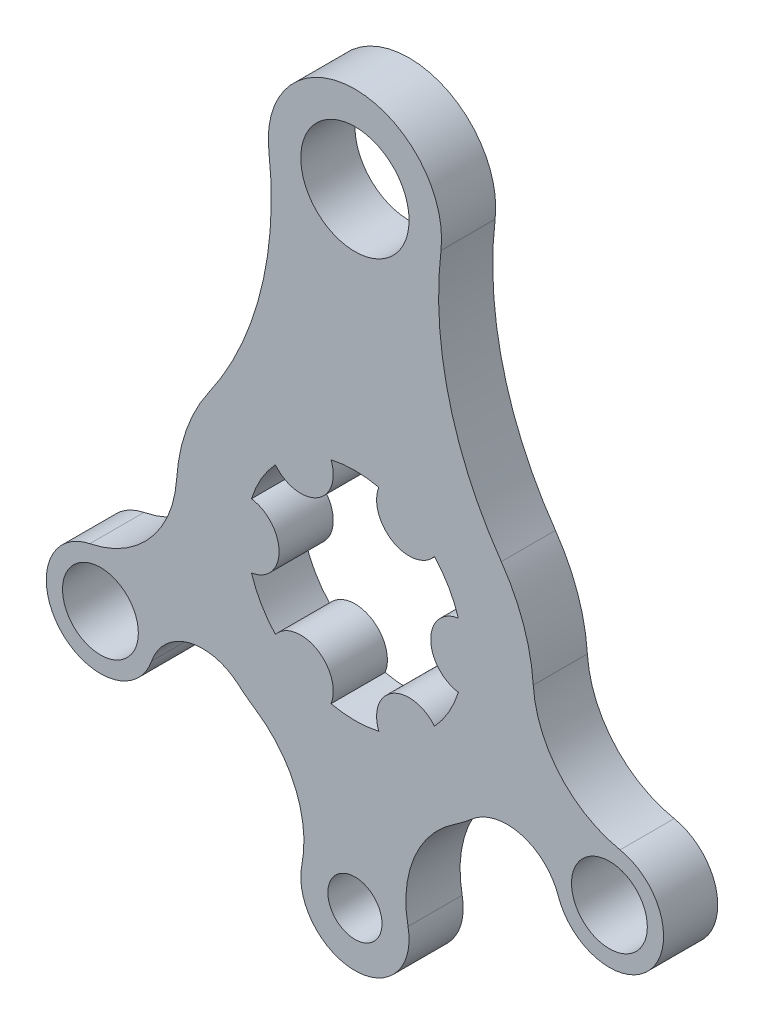
ISO-10303-21;
HEADER;
FILE_DESCRIPTION(('STEP AP214'),'2;1');
FILE_NAME('part.step','',(''),(''),'','','');
FILE_SCHEMA(('AUTOMOTIVE_DESIGN { 1 0 10303 214 1 1 1 1 }'));
ENDSEC;
DATA;
#1=APPLICATION_CONTEXT('core data for automotive mechanical design processes');
#2=APPLICATION_PROTOCOL_DEFINITION('international standard','automotive_design',2000,#1);
#3=PRODUCT_CONTEXT('',#1,'mechanical');
#4=PRODUCT('Part','Part','',(#3));
#5=PRODUCT_RELATED_PRODUCT_CATEGORY('part','',(#4));
#6=PRODUCT_DEFINITION_FORMATION('','',#4);
#7=PRODUCT_DEFINITION_CONTEXT('part definition',#1,'design');
#8=PRODUCT_DEFINITION('design','',#6,#7);
#9=PRODUCT_DEFINITION_SHAPE('','',#8);
#10=(LENGTH_UNIT() NAMED_UNIT(*) SI_UNIT(.MILLI.,.METRE.));
#11=(NAMED_UNIT(*) PLANE_ANGLE_UNIT() SI_UNIT($,.RADIAN.));
#12=(NAMED_UNIT(*) SI_UNIT($,.STERADIAN.) SOLID_ANGLE_UNIT());
#13=UNCERTAINTY_MEASURE_WITH_UNIT(LENGTH_MEASURE(1.E-05),#10,'distance_accuracy_value','');
#14=(GEOMETRIC_REPRESENTATION_CONTEXT(3) GLOBAL_UNCERTAINTY_ASSIGNED_CONTEXT((#13)) GLOBAL_UNIT_ASSIGNED_CONTEXT((#10,
#11,#12)) REPRESENTATION_CONTEXT('',''));
#15=CARTESIAN_POINT('',(0.,0.,0.));
#16=DIRECTION('',(0.,0.,1.));
#17=DIRECTION('',(1.,0.,0.));
#18=AXIS2_PLACEMENT_3D('',#15,#16,#17);
#19=CARTESIAN_POINT('',(0.,0.,5.));
#20=DIRECTION('',(0.,0.,-1.));
#21=DIRECTION('',(-1.,0.,0.));
#22=AXIS2_PLACEMENT_3D('',#19,#20,#21);
#23=CYLINDRICAL_SURFACE('',#22,20.);
#24=CARTESIAN_POINT('',(0.,0.,-5.));
#25=DIRECTION('',(0.,0.,1.));
#26=DIRECTION('',(1.,0.,0.));
#27=AXIS2_PLACEMENT_3D('',#24,#25,#26);
#28=CIRCLE('',#27,20.);
#29=CARTESIAN_POINT('',(19.1,5.93211597998556,-5.));
#30=VERTEX_POINT('',#29);
#31=CARTESIAN_POINT('',(14.6873631368633,13.5750272222898,-5.));
#32=VERTEX_POINT('',#31);
#33=EDGE_CURVE('E312',#30,#32,#28,.T.);
#34=ORIENTED_EDGE('',*,*,#33,.F.);
#35=DIRECTION('',(0.,0.,-1.));
#36=VECTOR('',#35,1.);
#37=CARTESIAN_POINT('',(19.1,5.93211597998556,5.));
#38=LINE('',#37,#36);
#39=CARTESIAN_POINT('',(19.1,5.93211597998556,5.));
#40=VERTEX_POINT('',#39);
#41=EDGE_CURVE('E11',#40,#30,#38,.T.);
#42=ORIENTED_EDGE('',*,*,#41,.F.);
#43=CARTESIAN_POINT('',(0.,0.,5.));
#44=DIRECTION('',(0.,0.,1.));
#45=DIRECTION('',(1.,0.,0.));
#46=AXIS2_PLACEMENT_3D('',#43,#44,#45);
#47=CIRCLE('',#46,20.);
#48=CARTESIAN_POINT('',(14.6873631368633,13.5750272222898,5.));
#49=VERTEX_POINT('',#48);
#50=EDGE_CURVE('E517',#40,#49,#47,.T.);
#51=ORIENTED_EDGE('',*,*,#50,.T.);
#52=DIRECTION('',(0.,0.,-1.));
#53=VECTOR('',#52,1.);
#54=CARTESIAN_POINT('',(14.6873631368633,13.5750272222898,5.));
#55=LINE('',#54,#53);
#56=EDGE_CURVE('E150',#49,#32,#55,.T.);
#57=ORIENTED_EDGE('',*,*,#56,.T.);
#58=EDGE_LOOP('',(#34,#42,#51,#57));
#59=FACE_BOUND('',#58,.T.);
#60=ADVANCED_FACE('F37',(#59),#23,.F.);
#61=CARTESIAN_POINT('',(20.,0.,5.));
#62=DIRECTION('',(0.,0.,-1.));
#63=DIRECTION('',(-1.,0.,0.));
#64=AXIS2_PLACEMENT_3D('',#61,#62,#63);
#65=CYLINDRICAL_SURFACE('',#64,6.);
#66=CARTESIAN_POINT('',(20.,0.,-5.));
#67=DIRECTION('',(0.,0.,1.));
#68=DIRECTION('',(1.,0.,0.));
#69=AXIS2_PLACEMENT_3D('',#66,#67,#68);
#70=CIRCLE('',#69,6.);
#71=CARTESIAN_POINT('',(19.1,-5.93211597998556,-5.));
#72=VERTEX_POINT('',#71);
#73=EDGE_CURVE('E315',#30,#72,#70,.T.);
#74=ORIENTED_EDGE('',*,*,#73,.T.);
#75=DIRECTION('',(0.,0.,-1.));
#76=VECTOR('',#75,1.);
#77=CARTESIAN_POINT('',(19.1,-5.93211597998556,5.));
#78=LINE('',#77,#76);
#79=CARTESIAN_POINT('',(19.1,-5.93211597998556,5.));
#80=VERTEX_POINT('',#79);
#81=EDGE_CURVE('E47',#80,#72,#78,.T.);
#82=ORIENTED_EDGE('',*,*,#81,.F.);
#83=CARTESIAN_POINT('',(20.,0.,5.));
#84=DIRECTION('',(0.,0.,1.));
#85=DIRECTION('',(1.,0.,0.));
#86=AXIS2_PLACEMENT_3D('',#83,#84,#85);
#87=CIRCLE('',#86,6.);
#88=EDGE_CURVE('E519',#40,#80,#87,.T.);
#89=ORIENTED_EDGE('',*,*,#88,.F.);
#90=ORIENTED_EDGE('',*,*,#41,.T.);
#91=EDGE_LOOP('',(#74,#82,#89,#90));
#92=FACE_BOUND('',#91,.T.);
#93=ADVANCED_FACE('F548',(#92),#65,.T.);
#94=CARTESIAN_POINT('',(0.,0.,5.));
#95=DIRECTION('',(0.,0.,-1.));
#96=DIRECTION('',(-1.,0.,0.));
#97=AXIS2_PLACEMENT_3D('',#94,#95,#96);
#98=CYLINDRICAL_SURFACE('',#97,20.);
#99=CARTESIAN_POINT('',(0.,0.,-5.));
#100=DIRECTION('',(0.,0.,1.));
#101=DIRECTION('',(1.,0.,0.));
#102=AXIS2_PLACEMENT_3D('',#99,#100,#101);
#103=CIRCLE('',#102,20.);
#104=CARTESIAN_POINT('',(14.6873631368631,-13.57502722229,-5.));
#105=VERTEX_POINT('',#104);
#106=EDGE_CURVE('E318',#105,#72,#103,.T.);
#107=ORIENTED_EDGE('',*,*,#106,.F.);
#108=DIRECTION('',(0.,0.,-1.));
#109=VECTOR('',#108,1.);
#110=CARTESIAN_POINT('',(14.6873631368631,-13.57502722229,5.));
#111=LINE('',#110,#109);
#112=CARTESIAN_POINT('',(14.6873631368631,-13.57502722229,5.));
#113=VERTEX_POINT('',#112);
#114=EDGE_CURVE('E367',#113,#105,#111,.T.);
#115=ORIENTED_EDGE('',*,*,#114,.F.);
#116=CARTESIAN_POINT('',(0.,0.,5.));
#117=DIRECTION('',(0.,0.,1.));
#118=DIRECTION('',(1.,0.,0.));
#119=AXIS2_PLACEMENT_3D('',#116,#117,#118);
#120=CIRCLE('',#119,20.);
#121=EDGE_CURVE('E521',#113,#80,#120,.T.);
#122=ORIENTED_EDGE('',*,*,#121,.T.);
#123=ORIENTED_EDGE('',*,*,#81,.T.);
#124=EDGE_LOOP('',(#107,#115,#122,#123));
#125=FACE_BOUND('',#124,.T.);
#126=ADVANCED_FACE('F551',(#125),#98,.F.);
#127=CARTESIAN_POINT('',(10.,-17.3205080756888,5.));
#128=DIRECTION('',(0.,0.,-1.));
#129=DIRECTION('',(-1.,0.,0.));
#130=AXIS2_PLACEMENT_3D('',#127,#128,#129);
#131=CYLINDRICAL_SURFACE('',#130,6.);
#132=CARTESIAN_POINT('',(10.,-17.3205080756888,-5.));
#133=DIRECTION('',(0.,0.,1.));
#134=DIRECTION('',(1.,0.,0.));
#135=AXIS2_PLACEMENT_3D('',#132,#133,#134);
#136=CIRCLE('',#135,6.);
#137=CARTESIAN_POINT('',(4.41263686313688,-19.5071432022755,-5.));
#138=VERTEX_POINT('',#137);
#139=EDGE_CURVE('E321',#105,#138,#136,.T.);
#140=ORIENTED_EDGE('',*,*,#139,.T.);
#141=DIRECTION('',(0.,0.,-1.));
#142=VECTOR('',#141,1.);
#143=CARTESIAN_POINT('',(4.41263686313688,-19.5071432022755,5.));
#144=LINE('',#143,#142);
#145=CARTESIAN_POINT('',(4.41263686313688,-19.5071432022755,5.));
#146=VERTEX_POINT('',#145);
#147=EDGE_CURVE('E365',#146,#138,#144,.T.);
#148=ORIENTED_EDGE('',*,*,#147,.F.);
#149=CARTESIAN_POINT('',(10.,-17.3205080756888,5.));
#150=DIRECTION('',(0.,0.,1.));
#151=DIRECTION('',(1.,0.,0.));
#152=AXIS2_PLACEMENT_3D('',#149,#150,#151);
#153=CIRCLE('',#152,6.);
#154=EDGE_CURVE('E524',#113,#146,#153,.T.);
#155=ORIENTED_EDGE('',*,*,#154,.F.);
#156=ORIENTED_EDGE('',*,*,#114,.T.);
#157=EDGE_LOOP('',(#140,#148,#155,#156));
#158=FACE_BOUND('',#157,.T.);
#159=ADVANCED_FACE('F556',(#158),#131,.T.);
#160=CARTESIAN_POINT('',(0.,0.,5.));
#161=DIRECTION('',(0.,0.,-1.));
#162=DIRECTION('',(-1.,0.,0.));
#163=AXIS2_PLACEMENT_3D('',#160,#161,#162);
#164=CYLINDRICAL_SURFACE('',#163,20.);
#165=CARTESIAN_POINT('',(0.,0.,-5.));
#166=DIRECTION('',(0.,0.,1.));
#167=DIRECTION('',(1.,0.,0.));
#168=AXIS2_PLACEMENT_3D('',#165,#166,#167);
#169=CIRCLE('',#168,20.);
#170=CARTESIAN_POINT('',(-4.41263686313698,-19.5071432022755,-5.));
#171=VERTEX_POINT('',#170);
#172=EDGE_CURVE('E324',#171,#138,#169,.T.);
#173=ORIENTED_EDGE('',*,*,#172,.F.);
#174=DIRECTION('',(0.,0.,-1.));
#175=VECTOR('',#174,1.);
#176=CARTESIAN_POINT('',(-4.41263686313698,-19.5071432022755,5.));
#177=LINE('',#176,#175);
#178=CARTESIAN_POINT('',(-4.41263686313698,-19.5071432022755,5.));
#179=VERTEX_POINT('',#178);
#180=EDGE_CURVE('E363',#179,#171,#177,.T.);
#181=ORIENTED_EDGE('',*,*,#180,.F.);
#182=CARTESIAN_POINT('',(0.,0.,5.));
#183=DIRECTION('',(0.,0.,1.));
#184=DIRECTION('',(1.,0.,0.));
#185=AXIS2_PLACEMENT_3D('',#182,#183,#184);
#186=CIRCLE('',#185,20.);
#187=EDGE_CURVE('E526',#179,#146,#186,.T.);
#188=ORIENTED_EDGE('',*,*,#187,.T.);
#189=ORIENTED_EDGE('',*,*,#147,.T.);
#190=EDGE_LOOP('',(#173,#181,#188,#189));
#191=FACE_BOUND('',#190,.T.);
#192=ADVANCED_FACE('F563',(#191),#164,.F.);
#193=CARTESIAN_POINT('',(-10.0000000000001,-17.3205080756887,5.));
#194=DIRECTION('',(0.,0.,-1.));
#195=DIRECTION('',(-1.,0.,0.));
#196=AXIS2_PLACEMENT_3D('',#193,#194,#195);
#197=CYLINDRICAL_SURFACE('',#196,5.99999999999999);
#198=CARTESIAN_POINT('',(-10.0000000000001,-17.3205080756887,-5.));
#199=DIRECTION('',(0.,0.,1.));
#200=DIRECTION('',(1.,0.,0.));
#201=AXIS2_PLACEMENT_3D('',#198,#199,#200);
#202=CIRCLE('',#201,5.99999999999999);
#203=CARTESIAN_POINT('',(-14.6873631368632,-13.5750272222899,-5.));
#204=VERTEX_POINT('',#203);
#205=EDGE_CURVE('E327',#171,#204,#202,.T.);
#206=ORIENTED_EDGE('',*,*,#205,.T.);
#207=DIRECTION('',(0.,0.,-1.));
#208=VECTOR('',#207,1.);
#209=CARTESIAN_POINT('',(-14.6873631368632,-13.5750272222899,5.));
#210=LINE('',#209,#208);
#211=CARTESIAN_POINT('',(-14.6873631368632,-13.5750272222899,5.));
#212=VERTEX_POINT('',#211);
#213=EDGE_CURVE('E361',#212,#204,#210,.T.);
#214=ORIENTED_EDGE('',*,*,#213,.F.);
#215=CARTESIAN_POINT('',(-10.0000000000001,-17.3205080756887,5.));
#216=DIRECTION('',(0.,0.,1.));
#217=DIRECTION('',(1.,0.,0.));
#218=AXIS2_PLACEMENT_3D('',#215,#216,#217);
#219=CIRCLE('',#218,5.99999999999999);
#220=EDGE_CURVE('E529',#179,#212,#219,.T.);
#221=ORIENTED_EDGE('',*,*,#220,.F.);
#222=ORIENTED_EDGE('',*,*,#180,.T.);
#223=EDGE_LOOP('',(#206,#214,#221,#222));
#224=FACE_BOUND('',#223,.T.);
#225=ADVANCED_FACE('F566',(#224),#197,.T.);
#226=CARTESIAN_POINT('',(0.,0.,5.));
#227=DIRECTION('',(0.,0.,-1.));
#228=DIRECTION('',(-1.,0.,0.));
#229=AXIS2_PLACEMENT_3D('',#226,#227,#228);
#230=CYLINDRICAL_SURFACE('',#229,20.);
#231=CARTESIAN_POINT('',(0.,0.,-5.));
#232=DIRECTION('',(0.,0.,1.));
#233=DIRECTION('',(1.,0.,0.));
#234=AXIS2_PLACEMENT_3D('',#231,#232,#233);
#235=CIRCLE('',#234,20.);
#236=CARTESIAN_POINT('',(-19.1,-5.93211597998557,-5.));
#237=VERTEX_POINT('',#236);
#238=EDGE_CURVE('E330',#237,#204,#235,.T.);
#239=ORIENTED_EDGE('',*,*,#238,.F.);
#240=DIRECTION('',(0.,0.,-1.));
#241=VECTOR('',#240,1.);
#242=CARTESIAN_POINT('',(-19.1,-5.93211597998557,5.));
#243=LINE('',#242,#241);
#244=CARTESIAN_POINT('',(-19.1,-5.93211597998557,5.));
#245=VERTEX_POINT('',#244);
#246=EDGE_CURVE('E359',#245,#237,#243,.T.);
#247=ORIENTED_EDGE('',*,*,#246,.F.);
#248=CARTESIAN_POINT('',(0.,0.,5.));
#249=DIRECTION('',(0.,0.,1.));
#250=DIRECTION('',(1.,0.,0.));
#251=AXIS2_PLACEMENT_3D('',#248,#249,#250);
#252=CIRCLE('',#251,20.);
#253=EDGE_CURVE('E531',#245,#212,#252,.T.);
#254=ORIENTED_EDGE('',*,*,#253,.T.);
#255=ORIENTED_EDGE('',*,*,#213,.T.);
#256=EDGE_LOOP('',(#239,#247,#254,#255));
#257=FACE_BOUND('',#256,.T.);
#258=ADVANCED_FACE('F569',(#257),#230,.F.);
#259=CARTESIAN_POINT('',(-20.,0.,5.));
#260=DIRECTION('',(0.,0.,-1.));
#261=DIRECTION('',(-1.,0.,0.));
#262=AXIS2_PLACEMENT_3D('',#259,#260,#261);
#263=CYLINDRICAL_SURFACE('',#262,6.);
#264=CARTESIAN_POINT('',(-20.,0.,-5.));
#265=DIRECTION('',(0.,0.,1.));
#266=DIRECTION('',(1.,0.,0.));
#267=AXIS2_PLACEMENT_3D('',#264,#265,#266);
#268=CIRCLE('',#267,6.);
#269=CARTESIAN_POINT('',(-19.1,5.93211597998555,-5.));
#270=VERTEX_POINT('',#269);
#271=EDGE_CURVE('E333',#237,#270,#268,.T.);
#272=ORIENTED_EDGE('',*,*,#271,.T.);
#273=DIRECTION('',(0.,0.,-1.));
#274=VECTOR('',#273,1.);
#275=CARTESIAN_POINT('',(-19.1,5.93211597998555,5.));
#276=LINE('',#275,#274);
#277=CARTESIAN_POINT('',(-19.1,5.93211597998555,5.));
#278=VERTEX_POINT('',#277);
#279=EDGE_CURVE('E357',#278,#270,#276,.T.);
#280=ORIENTED_EDGE('',*,*,#279,.F.);
#281=CARTESIAN_POINT('',(-20.,0.,5.));
#282=DIRECTION('',(0.,0.,1.));
#283=DIRECTION('',(1.,0.,0.));
#284=AXIS2_PLACEMENT_3D('',#281,#282,#283);
#285=CIRCLE('',#284,6.);
#286=EDGE_CURVE('E534',#245,#278,#285,.T.);
#287=ORIENTED_EDGE('',*,*,#286,.F.);
#288=ORIENTED_EDGE('',*,*,#246,.T.);
#289=EDGE_LOOP('',(#272,#280,#287,#288));
#290=FACE_BOUND('',#289,.T.);
#291=ADVANCED_FACE('F572',(#290),#263,.T.);
#292=CARTESIAN_POINT('',(0.,0.,5.));
#293=DIRECTION('',(0.,0.,-1.));
#294=DIRECTION('',(-1.,0.,0.));
#295=AXIS2_PLACEMENT_3D('',#292,#293,#294);
#296=CYLINDRICAL_SURFACE('',#295,20.);
#297=CARTESIAN_POINT('',(0.,0.,-5.));
#298=DIRECTION('',(0.,0.,1.));
#299=DIRECTION('',(1.,0.,0.));
#300=AXIS2_PLACEMENT_3D('',#297,#298,#299);
#301=CIRCLE('',#300,20.);
#302=CARTESIAN_POINT('',(-14.6873631368631,13.57502722229,-5.));
#303=VERTEX_POINT('',#302);
#304=EDGE_CURVE('E336',#303,#270,#301,.T.);
#305=ORIENTED_EDGE('',*,*,#304,.F.);
#306=DIRECTION('',(0.,0.,-1.));
#307=VECTOR('',#306,1.);
#308=CARTESIAN_POINT('',(-14.6873631368631,13.57502722229,5.));
#309=LINE('',#308,#307);
#310=CARTESIAN_POINT('',(-14.6873631368631,13.57502722229,5.));
#311=VERTEX_POINT('',#310);
#312=EDGE_CURVE('E250',#311,#303,#309,.T.);
#313=ORIENTED_EDGE('',*,*,#312,.F.);
#314=CARTESIAN_POINT('',(0.,0.,5.));
#315=DIRECTION('',(0.,0.,1.));
#316=DIRECTION('',(1.,0.,0.));
#317=AXIS2_PLACEMENT_3D('',#314,#315,#316);
#318=CIRCLE('',#317,20.);
#319=EDGE_CURVE('E239',#311,#278,#318,.T.);
#320=ORIENTED_EDGE('',*,*,#319,.T.);
#321=ORIENTED_EDGE('',*,*,#279,.T.);
#322=EDGE_LOOP('',(#305,#313,#320,#321));
#323=FACE_BOUND('',#322,.T.);
#324=ADVANCED_FACE('F537',(#323),#296,.F.);
#325=CARTESIAN_POINT('',(-10.,17.3205080756888,5.));
#326=DIRECTION('',(0.,0.,-1.));
#327=DIRECTION('',(-1.,0.,0.));
#328=AXIS2_PLACEMENT_3D('',#325,#326,#327);
#329=CYLINDRICAL_SURFACE('',#328,6.00000000000001);
#330=CARTESIAN_POINT('',(-10.,17.3205080756888,-5.));
#331=DIRECTION('',(0.,0.,1.));
#332=DIRECTION('',(1.,0.,0.));
#333=AXIS2_PLACEMENT_3D('',#330,#331,#332);
#334=CIRCLE('',#333,6.00000000000001);
#335=CARTESIAN_POINT('',(-4.41263686313689,19.5071432022756,-5.));
#336=VERTEX_POINT('',#335);
#337=EDGE_CURVE('E246',#303,#336,#334,.T.);
#338=ORIENTED_EDGE('',*,*,#337,.T.);
#339=DIRECTION('',(0.,0.,-1.));
#340=VECTOR('',#339,1.);
#341=CARTESIAN_POINT('',(-4.41263686313689,19.5071432022756,5.));
#342=LINE('',#341,#340);
#343=CARTESIAN_POINT('',(-4.41263686313689,19.5071432022756,5.));
#344=VERTEX_POINT('',#343);
#345=EDGE_CURVE('E243',#344,#336,#342,.T.);
#346=ORIENTED_EDGE('',*,*,#345,.F.);
#347=CARTESIAN_POINT('',(-10.,17.3205080756888,5.));
#348=DIRECTION('',(0.,0.,1.));
#349=DIRECTION('',(1.,0.,0.));
#350=AXIS2_PLACEMENT_3D('',#347,#348,#349);
#351=CIRCLE('',#350,6.00000000000001);
#352=EDGE_CURVE('E232',#311,#344,#351,.T.);
#353=ORIENTED_EDGE('',*,*,#352,.F.);
#354=ORIENTED_EDGE('',*,*,#312,.T.);
#355=EDGE_LOOP('',(#338,#346,#353,#354));
#356=FACE_BOUND('',#355,.T.);
#357=ADVANCED_FACE('F244',(#356),#329,.T.);
#358=CARTESIAN_POINT('',(0.,0.,5.));
#359=DIRECTION('',(0.,0.,-1.));
#360=DIRECTION('',(-1.,0.,0.));
#361=AXIS2_PLACEMENT_3D('',#358,#359,#360);
#362=CYLINDRICAL_SURFACE('',#361,20.);
#363=CARTESIAN_POINT('',(0.,0.,-5.));
#364=DIRECTION('',(0.,0.,1.));
#365=DIRECTION('',(1.,0.,0.));
#366=AXIS2_PLACEMENT_3D('',#363,#364,#365);
#367=CIRCLE('',#366,20.);
#368=CARTESIAN_POINT('',(4.4126368631371,19.5071432022755,-5.));
#369=VERTEX_POINT('',#368);
#370=EDGE_CURVE('E340',#369,#336,#367,.T.);
#371=ORIENTED_EDGE('',*,*,#370,.F.);
#372=DIRECTION('',(0.,0.,-1.));
#373=VECTOR('',#372,1.);
#374=CARTESIAN_POINT('',(4.4126368631371,19.5071432022755,5.));
#375=LINE('',#374,#373);
#376=CARTESIAN_POINT('',(4.4126368631371,19.5071432022755,5.));
#377=VERTEX_POINT('',#376);
#378=EDGE_CURVE('E143',#377,#369,#375,.T.);
#379=ORIENTED_EDGE('',*,*,#378,.F.);
#380=CARTESIAN_POINT('',(0.,0.,5.));
#381=DIRECTION('',(0.,0.,1.));
#382=DIRECTION('',(1.,0.,0.));
#383=AXIS2_PLACEMENT_3D('',#380,#381,#382);
#384=CIRCLE('',#383,20.);
#385=EDGE_CURVE('E237',#377,#344,#384,.T.);
#386=ORIENTED_EDGE('',*,*,#385,.T.);
#387=ORIENTED_EDGE('',*,*,#345,.T.);
#388=EDGE_LOOP('',(#371,#379,#386,#387));
#389=FACE_BOUND('',#388,.T.);
#390=ADVANCED_FACE('F252',(#389),#362,.F.);
#391=CARTESIAN_POINT('',(52.8897897671533,3.41615842523861,5.));
#392=DIRECTION('',(0.,0.,-1.));
#393=DIRECTION('',(-1.,0.,0.));
#394=AXIS2_PLACEMENT_3D('',#391,#392,#393);
#395=CYLINDRICAL_SURFACE('',#394,20.);
#396=CARTESIAN_POINT('',(52.8897897671533,3.41615842523861,-5.));
#397=DIRECTION('',(0.,0.,1.));
#398=DIRECTION('',(1.,0.,0.));
#399=AXIS2_PLACEMENT_3D('',#396,#397,#398);
#400=CIRCLE('',#399,20.);
#401=CARTESIAN_POINT('',(32.9313785342653,2.12704203835612,-5.));
#402=VERTEX_POINT('',#401);
#403=CARTESIAN_POINT('',(48.9632632557178,-16.1946138582538,-5.));
#404=VERTEX_POINT('',#403);
#405=EDGE_CURVE('E267',#402,#404,#400,.T.);
#406=ORIENTED_EDGE('',*,*,#405,.F.);
#407=DIRECTION('',(0.,0.,-1.));
#408=VECTOR('',#407,1.);
#409=CARTESIAN_POINT('',(32.9313785342653,2.12704203835612,5.));
#410=LINE('',#409,#408);
#411=CARTESIAN_POINT('',(32.9313785342653,2.12704203835612,5.));
#412=VERTEX_POINT('',#411);
#413=EDGE_CURVE('E41',#412,#402,#410,.T.);
#414=ORIENTED_EDGE('',*,*,#413,.F.);
#415=CARTESIAN_POINT('',(52.8897897671533,3.41615842523861,5.));
#416=DIRECTION('',(0.,0.,1.));
#417=DIRECTION('',(1.,0.,0.));
#418=AXIS2_PLACEMENT_3D('',#415,#416,#417);
#419=CIRCLE('',#418,20.);
#420=CARTESIAN_POINT('',(48.9632632557178,-16.1946138582538,5.));
#421=VERTEX_POINT('',#420);
#422=EDGE_CURVE('E353',#412,#421,#419,.T.);
#423=ORIENTED_EDGE('',*,*,#422,.T.);
#424=DIRECTION('',(0.,0.,-1.));
#425=VECTOR('',#424,1.);
#426=CARTESIAN_POINT('',(48.9632632557178,-16.1946138582538,5.));
#427=LINE('',#426,#425);
#428=EDGE_CURVE('E266',#421,#404,#427,.T.);
#429=ORIENTED_EDGE('',*,*,#428,.T.);
#430=EDGE_LOOP('',(#406,#414,#423,#429));
#431=FACE_BOUND('',#430,.T.);
#432=ADVANCED_FACE('F39',(#431),#395,.F.);
#433=CARTESIAN_POINT('',(0.,0.,5.));
#434=DIRECTION('',(0.,0.,-1.));
#435=DIRECTION('',(-1.,0.,0.));
#436=AXIS2_PLACEMENT_3D('',#433,#434,#435);
#437=CYLINDRICAL_SURFACE('',#436,33.);
#438=CARTESIAN_POINT('',(0.,0.,-5.));
#439=DIRECTION('',(0.,0.,1.));
#440=DIRECTION('',(1.,0.,0.));
#441=AXIS2_PLACEMENT_3D('',#438,#439,#440);
#442=CIRCLE('',#441,33.);
#443=CARTESIAN_POINT('',(27.0298161974661,18.931165741475,-5.));
#444=VERTEX_POINT('',#443);
#445=EDGE_CURVE('E270',#402,#444,#442,.T.);
#446=ORIENTED_EDGE('',*,*,#445,.T.);
#447=DIRECTION('',(0.,0.,-1.));
#448=VECTOR('',#447,1.);
#449=CARTESIAN_POINT('',(27.0298161974661,18.931165741475,5.));
#450=LINE('',#449,#448);
#451=CARTESIAN_POINT('',(27.0298161974661,18.931165741475,5.));
#452=VERTEX_POINT('',#451);
#453=EDGE_CURVE('E402',#452,#444,#450,.T.);
#454=ORIENTED_EDGE('',*,*,#453,.F.);
#455=CARTESIAN_POINT('',(0.,0.,5.));
#456=DIRECTION('',(0.,0.,1.));
#457=DIRECTION('',(1.,0.,0.));
#458=AXIS2_PLACEMENT_3D('',#455,#456,#457);
#459=CIRCLE('',#458,33.);
#460=EDGE_CURVE('E410',#412,#452,#459,.T.);
#461=ORIENTED_EDGE('',*,*,#460,.F.);
#462=ORIENTED_EDGE('',*,*,#413,.T.);
#463=EDGE_LOOP('',(#446,#454,#461,#462));
#464=FACE_BOUND('',#463,.T.);
#465=ADVANCED_FACE('F409',(#464),#437,.T.);
#466=CARTESIAN_POINT('',(79.4512779137641,55.6461538461538,5.));
#467=DIRECTION('',(0.,0.,-1.));
#468=DIRECTION('',(-1.,0.,0.));
#469=AXIS2_PLACEMENT_3D('',#466,#467,#468);
#470=CYLINDRICAL_SURFACE('',#469,64.);
#471=CARTESIAN_POINT('',(79.4512779137641,55.6461538461538,-5.));
#472=DIRECTION('',(0.,0.,1.));
#473=DIRECTION('',(1.,0.,0.));
#474=AXIS2_PLACEMENT_3D('',#471,#472,#473);
#475=CIRCLE('',#474,64.);
#476=CARTESIAN_POINT('',(15.8902555827528,63.1292307692308,-5.));
#477=VERTEX_POINT('',#476);
#478=EDGE_CURVE('E273',#477,#444,#475,.T.);
#479=ORIENTED_EDGE('',*,*,#478,.F.);
#480=DIRECTION('',(0.,0.,-1.));
#481=VECTOR('',#480,1.);
#482=CARTESIAN_POINT('',(15.8902555827528,63.1292307692308,5.));
#483=LINE('',#482,#481);
#484=CARTESIAN_POINT('',(15.8902555827528,63.1292307692308,5.));
#485=VERTEX_POINT('',#484);
#486=EDGE_CURVE('E401',#485,#477,#483,.T.);
#487=ORIENTED_EDGE('',*,*,#486,.F.);
#488=CARTESIAN_POINT('',(79.4512779137641,55.6461538461538,5.));
#489=DIRECTION('',(0.,0.,1.));
#490=DIRECTION('',(1.,0.,0.));
#491=AXIS2_PLACEMENT_3D('',#488,#489,#490);
#492=CIRCLE('',#491,64.);
#493=EDGE_CURVE('E491',#485,#452,#492,.T.);
#494=ORIENTED_EDGE('',*,*,#493,.T.);
#495=ORIENTED_EDGE('',*,*,#453,.T.);
#496=EDGE_LOOP('',(#479,#487,#494,#495));
#497=FACE_BOUND('',#496,.T.);
#498=ADVANCED_FACE('F490',(#497),#470,.F.);
#499=CARTESIAN_POINT('',(0.,65.,5.));
#500=DIRECTION('',(0.,0.,-1.));
#501=DIRECTION('',(-1.,0.,0.));
#502=AXIS2_PLACEMENT_3D('',#499,#500,#501);
#503=CYLINDRICAL_SURFACE('',#502,16.);
#504=CARTESIAN_POINT('',(0.,65.,-5.));
#505=DIRECTION('',(0.,0.,1.));
#506=DIRECTION('',(1.,0.,0.));
#507=AXIS2_PLACEMENT_3D('',#504,#505,#506);
#508=CIRCLE('',#507,16.);
#509=CARTESIAN_POINT('',(-15.8902555827528,63.1292307692308,-5.));
#510=VERTEX_POINT('',#509);
#511=EDGE_CURVE('E276',#477,#510,#508,.T.);
#512=ORIENTED_EDGE('',*,*,#511,.T.);
#513=DIRECTION('',(0.,0.,-1.));
#514=VECTOR('',#513,1.);
#515=CARTESIAN_POINT('',(-15.8902555827528,63.1292307692308,5.));
#516=LINE('',#515,#514);
#517=CARTESIAN_POINT('',(-15.8902555827528,63.1292307692308,5.));
#518=VERTEX_POINT('',#517);
#519=EDGE_CURVE('E398',#518,#510,#516,.T.);
#520=ORIENTED_EDGE('',*,*,#519,.F.);
#521=CARTESIAN_POINT('',(0.,65.,5.));
#522=DIRECTION('',(0.,0.,1.));
#523=DIRECTION('',(1.,0.,0.));
#524=AXIS2_PLACEMENT_3D('',#521,#522,#523);
#525=CIRCLE('',#524,16.);
#526=EDGE_CURVE('E488',#485,#518,#525,.T.);
#527=ORIENTED_EDGE('',*,*,#526,.F.);
#528=ORIENTED_EDGE('',*,*,#486,.T.);
#529=EDGE_LOOP('',(#512,#520,#527,#528));
#530=FACE_BOUND('',#529,.T.);
#531=ADVANCED_FACE('F487',(#530),#503,.T.);
#532=CARTESIAN_POINT('',(-79.4512779137641,55.6461538461538,5.));
#533=DIRECTION('',(0.,0.,-1.));
#534=DIRECTION('',(-1.,0.,0.));
#535=AXIS2_PLACEMENT_3D('',#532,#533,#534);
#536=CYLINDRICAL_SURFACE('',#535,64.);
#537=CARTESIAN_POINT('',(-79.4512779137641,55.6461538461538,-5.));
#538=DIRECTION('',(0.,0.,1.));
#539=DIRECTION('',(1.,0.,0.));
#540=AXIS2_PLACEMENT_3D('',#537,#538,#539);
#541=CIRCLE('',#540,64.);
#542=CARTESIAN_POINT('',(-27.0298161974661,18.931165741475,-5.));
#543=VERTEX_POINT('',#542);
#544=EDGE_CURVE('E278',#510,#543,#541,.F.);
#545=ORIENTED_EDGE('',*,*,#544,.T.);
#546=DIRECTION('',(0.,0.,-1.));
#547=VECTOR('',#546,1.);
#548=CARTESIAN_POINT('',(-27.0298161974661,18.931165741475,5.));
#549=LINE('',#548,#547);
#550=CARTESIAN_POINT('',(-27.0298161974661,18.931165741475,5.));
#551=VERTEX_POINT('',#550);
#552=EDGE_CURVE('E395',#551,#543,#549,.T.);
#553=ORIENTED_EDGE('',*,*,#552,.F.);
#554=CARTESIAN_POINT('',(-79.4512779137641,55.6461538461538,5.));
#555=DIRECTION('',(0.,0.,1.));
#556=DIRECTION('',(1.,0.,0.));
#557=AXIS2_PLACEMENT_3D('',#554,#555,#556);
#558=CIRCLE('',#557,64.);
#559=EDGE_CURVE('E483',#518,#551,#558,.F.);
#560=ORIENTED_EDGE('',*,*,#559,.F.);
#561=ORIENTED_EDGE('',*,*,#519,.T.);
#562=EDGE_LOOP('',(#545,#553,#560,#561));
#563=FACE_BOUND('',#562,.T.);
#564=ADVANCED_FACE('F482',(#563),#536,.F.);
#565=CARTESIAN_POINT('',(0.,0.,5.));
#566=DIRECTION('',(0.,0.,-1.));
#567=DIRECTION('',(-1.,0.,0.));
#568=AXIS2_PLACEMENT_3D('',#565,#566,#567);
#569=CYLINDRICAL_SURFACE('',#568,33.);
#570=CARTESIAN_POINT('',(0.,0.,-5.));
#571=DIRECTION('',(0.,0.,1.));
#572=DIRECTION('',(1.,0.,0.));
#573=AXIS2_PLACEMENT_3D('',#570,#571,#572);
#574=CIRCLE('',#573,33.);
#575=CARTESIAN_POINT('',(-32.9313785342652,2.12704203835611,-5.));
#576=VERTEX_POINT('',#575);
#577=EDGE_CURVE('E280',#543,#576,#574,.T.);
#578=ORIENTED_EDGE('',*,*,#577,.T.);
#579=DIRECTION('',(0.,0.,-1.));
#580=VECTOR('',#579,1.);
#581=CARTESIAN_POINT('',(-32.9313785342652,2.12704203835611,5.));
#582=LINE('',#581,#580);
#583=CARTESIAN_POINT('',(-32.9313785342652,2.12704203835611,5.));
#584=VERTEX_POINT('',#583);
#585=EDGE_CURVE('E392',#584,#576,#582,.T.);
#586=ORIENTED_EDGE('',*,*,#585,.F.);
#587=CARTESIAN_POINT('',(0.,0.,5.));
#588=DIRECTION('',(0.,0.,1.));
#589=DIRECTION('',(1.,0.,0.));
#590=AXIS2_PLACEMENT_3D('',#587,#588,#589);
#591=CIRCLE('',#590,33.);
#592=EDGE_CURVE('E479',#551,#584,#591,.T.);
#593=ORIENTED_EDGE('',*,*,#592,.F.);
#594=ORIENTED_EDGE('',*,*,#552,.T.);
#595=EDGE_LOOP('',(#578,#586,#593,#594));
#596=FACE_BOUND('',#595,.T.);
#597=ADVANCED_FACE('F476',(#596),#569,.T.);
#598=CARTESIAN_POINT('',(-52.8897897671533,3.41615842523861,5.));
#599=DIRECTION('',(0.,0.,-1.));
#600=DIRECTION('',(-1.,0.,0.));
#601=AXIS2_PLACEMENT_3D('',#598,#599,#600);
#602=CYLINDRICAL_SURFACE('',#601,20.);
#603=CARTESIAN_POINT('',(-52.8897897671533,3.41615842523861,-5.));
#604=DIRECTION('',(0.,0.,1.));
#605=DIRECTION('',(1.,0.,0.));
#606=AXIS2_PLACEMENT_3D('',#603,#604,#605);
#607=CIRCLE('',#606,20.);
#608=CARTESIAN_POINT('',(-48.9632632557178,-16.1946138582538,-5.));
#609=VERTEX_POINT('',#608);
#610=EDGE_CURVE('E282',#576,#609,#607,.F.);
#611=ORIENTED_EDGE('',*,*,#610,.T.);
#612=DIRECTION('',(0.,0.,-1.));
#613=VECTOR('',#612,1.);
#614=CARTESIAN_POINT('',(-48.9632632557178,-16.1946138582538,5.));
#615=LINE('',#614,#613);
#616=CARTESIAN_POINT('',(-48.9632632557178,-16.1946138582538,5.));
#617=VERTEX_POINT('',#616);
#618=EDGE_CURVE('E390',#617,#609,#615,.T.);
#619=ORIENTED_EDGE('',*,*,#618,.F.);
#620=CARTESIAN_POINT('',(-52.8897897671533,3.41615842523861,5.));
#621=DIRECTION('',(0.,0.,1.));
#622=DIRECTION('',(1.,0.,0.));
#623=AXIS2_PLACEMENT_3D('',#620,#621,#622);
#624=CIRCLE('',#623,20.);
#625=EDGE_CURVE('E500',#584,#617,#624,.F.);
#626=ORIENTED_EDGE('',*,*,#625,.F.);
#627=ORIENTED_EDGE('',*,*,#585,.T.);
#628=EDGE_LOOP('',(#611,#619,#626,#627));
#629=FACE_BOUND('',#628,.T.);
#630=ADVANCED_FACE('F471',(#629),#602,.F.);
#631=CARTESIAN_POINT('',(-47.,-26.,5.));
#632=DIRECTION('',(0.,0.,-1.));
#633=DIRECTION('',(-1.,0.,0.));
#634=AXIS2_PLACEMENT_3D('',#631,#632,#633);
#635=CYLINDRICAL_SURFACE('',#634,10.);
#636=CARTESIAN_POINT('',(-47.,-26.,-5.));
#637=DIRECTION('',(0.,0.,1.));
#638=DIRECTION('',(1.,0.,0.));
#639=AXIS2_PLACEMENT_3D('',#636,#637,#638);
#640=CIRCLE('',#639,10.);
#641=CARTESIAN_POINT('',(-37.5509150364807,-29.2733458955926,-5.));
#642=VERTEX_POINT('',#641);
#643=EDGE_CURVE('E285',#642,#609,#640,.F.);
#644=ORIENTED_EDGE('',*,*,#643,.F.);
#645=DIRECTION('',(0.,0.,-1.));
#646=VECTOR('',#645,1.);
#647=CARTESIAN_POINT('',(-37.5509150364807,-29.2733458955926,5.));
#648=LINE('',#647,#646);
#649=CARTESIAN_POINT('',(-37.5509150364807,-29.2733458955926,5.));
#650=VERTEX_POINT('',#649);
#651=EDGE_CURVE('E388',#650,#642,#648,.T.);
#652=ORIENTED_EDGE('',*,*,#651,.F.);
#653=CARTESIAN_POINT('',(-47.,-26.,5.));
#654=DIRECTION('',(0.,0.,1.));
#655=DIRECTION('',(1.,0.,0.));
#656=AXIS2_PLACEMENT_3D('',#653,#654,#655);
#657=CIRCLE('',#656,10.);
#658=EDGE_CURVE('E468',#650,#617,#657,.F.);
#659=ORIENTED_EDGE('',*,*,#658,.T.);
#660=ORIENTED_EDGE('',*,*,#618,.T.);
#661=EDGE_LOOP('',(#644,#652,#659,#660));
#662=FACE_BOUND('',#661,.T.);
#663=ADVANCED_FACE('F465',(#662),#635,.T.);
#664=CARTESIAN_POINT('',(-28.1018300729614,-32.5466917911852,5.));
#665=DIRECTION('',(0.,0.,-1.));
#666=DIRECTION('',(-1.,0.,0.));
#667=AXIS2_PLACEMENT_3D('',#664,#665,#666);
#668=CYLINDRICAL_SURFACE('',#667,10.);
#669=CARTESIAN_POINT('',(-28.1018300729614,-32.5466917911852,-5.));
#670=DIRECTION('',(0.,0.,1.));
#671=DIRECTION('',(1.,0.,0.));
#672=AXIS2_PLACEMENT_3D('',#669,#670,#671);
#673=CIRCLE('',#672,10.);
#674=CARTESIAN_POINT('',(-21.566520753668,-24.9776937002119,-5.));
#675=VERTEX_POINT('',#674);
#676=EDGE_CURVE('E288',#642,#675,#673,.F.);
#677=ORIENTED_EDGE('',*,*,#676,.T.);
#678=DIRECTION('',(0.,0.,-1.));
#679=VECTOR('',#678,1.);
#680=CARTESIAN_POINT('',(-21.566520753668,-24.9776937002119,5.));
#681=LINE('',#680,#679);
#682=CARTESIAN_POINT('',(-21.566520753668,-24.9776937002119,5.));
#683=VERTEX_POINT('',#682);
#684=EDGE_CURVE('E385',#683,#675,#681,.T.);
#685=ORIENTED_EDGE('',*,*,#684,.F.);
#686=CARTESIAN_POINT('',(-28.1018300729614,-32.5466917911852,5.));
#687=DIRECTION('',(0.,0.,1.));
#688=DIRECTION('',(1.,0.,0.));
#689=AXIS2_PLACEMENT_3D('',#686,#687,#688);
#690=CIRCLE('',#689,10.);
#691=EDGE_CURVE('E460',#650,#683,#690,.F.);
#692=ORIENTED_EDGE('',*,*,#691,.F.);
#693=ORIENTED_EDGE('',*,*,#651,.T.);
#694=EDGE_LOOP('',(#677,#685,#692,#693));
#695=FACE_BOUND('',#694,.T.);
#696=ADVANCED_FACE('F459',(#695),#668,.F.);
#697=CARTESIAN_POINT('',(0.,0.,5.));
#698=DIRECTION('',(0.,0.,-1.));
#699=DIRECTION('',(-1.,0.,0.));
#700=AXIS2_PLACEMENT_3D('',#697,#698,#699);
#701=CYLINDRICAL_SURFACE('',#700,33.);
#702=CARTESIAN_POINT('',(0.,0.,-5.));
#703=DIRECTION('',(0.,0.,1.));
#704=DIRECTION('',(1.,0.,0.));
#705=AXIS2_PLACEMENT_3D('',#702,#703,#704);
#706=CIRCLE('',#705,33.);
#707=CARTESIAN_POINT('',(-18.3131972355137,-27.4522641509434,-5.));
#708=VERTEX_POINT('',#707);
#709=EDGE_CURVE('E290',#675,#708,#706,.T.);
#710=ORIENTED_EDGE('',*,*,#709,.T.);
#711=DIRECTION('',(0.,0.,-1.));
#712=VECTOR('',#711,1.);
#713=CARTESIAN_POINT('',(-18.3131972355137,-27.4522641509434,5.));
#714=LINE('',#713,#712);
#715=CARTESIAN_POINT('',(-18.3131972355137,-27.4522641509434,5.));
#716=VERTEX_POINT('',#715);
#717=EDGE_CURVE('E382',#716,#708,#714,.T.);
#718=ORIENTED_EDGE('',*,*,#717,.F.);
#719=CARTESIAN_POINT('',(0.,0.,5.));
#720=DIRECTION('',(0.,0.,1.));
#721=DIRECTION('',(1.,0.,0.));
#722=AXIS2_PLACEMENT_3D('',#719,#720,#721);
#723=CIRCLE('',#722,33.);
#724=EDGE_CURVE('E455',#683,#716,#723,.T.);
#725=ORIENTED_EDGE('',*,*,#724,.F.);
#726=ORIENTED_EDGE('',*,*,#684,.T.);
#727=EDGE_LOOP('',(#710,#718,#725,#726));
#728=FACE_BOUND('',#727,.T.);
#729=ADVANCED_FACE('F454',(#728),#701,.T.);
#730=CARTESIAN_POINT('',(-29.4121046509766,-44.09,5.));
#731=DIRECTION('',(0.,0.,-1.));
#732=DIRECTION('',(-1.,0.,0.));
#733=AXIS2_PLACEMENT_3D('',#730,#731,#732);
#734=CYLINDRICAL_SURFACE('',#733,20.);
#735=CARTESIAN_POINT('',(-29.4121046509766,-44.09,-5.));
#736=DIRECTION('',(0.,0.,1.));
#737=DIRECTION('',(1.,0.,0.));
#738=AXIS2_PLACEMENT_3D('',#735,#736,#737);
#739=CIRCLE('',#738,20.);
#740=CARTESIAN_POINT('',(-9.80403488365887,-48.03,-5.));
#741=VERTEX_POINT('',#740);
#742=EDGE_CURVE('E292',#708,#741,#739,.F.);
#743=ORIENTED_EDGE('',*,*,#742,.T.);
#744=DIRECTION('',(0.,0.,-1.));
#745=VECTOR('',#744,1.);
#746=CARTESIAN_POINT('',(-9.80403488365887,-48.03,5.));
#747=LINE('',#746,#745);
#748=CARTESIAN_POINT('',(-9.80403488365887,-48.03,5.));
#749=VERTEX_POINT('',#748);
#750=EDGE_CURVE('E379',#749,#741,#747,.T.);
#751=ORIENTED_EDGE('',*,*,#750,.F.);
#752=CARTESIAN_POINT('',(-29.4121046509766,-44.09,5.));
#753=DIRECTION('',(0.,0.,1.));
#754=DIRECTION('',(1.,0.,0.));
#755=AXIS2_PLACEMENT_3D('',#752,#753,#754);
#756=CIRCLE('',#755,20.);
#757=EDGE_CURVE('E451',#716,#749,#756,.F.);
#758=ORIENTED_EDGE('',*,*,#757,.F.);
#759=ORIENTED_EDGE('',*,*,#717,.T.);
#760=EDGE_LOOP('',(#743,#751,#758,#759));
#761=FACE_BOUND('',#760,.T.);
#762=ADVANCED_FACE('F448',(#761),#734,.F.);
#763=CARTESIAN_POINT('',(0.,-50.,5.));
#764=DIRECTION('',(0.,0.,-1.));
#765=DIRECTION('',(-1.,0.,0.));
#766=AXIS2_PLACEMENT_3D('',#763,#764,#765);
#767=CYLINDRICAL_SURFACE('',#766,10.);
#768=CARTESIAN_POINT('',(0.,-50.,-5.));
#769=DIRECTION('',(0.,0.,1.));
#770=DIRECTION('',(1.,0.,0.));
#771=AXIS2_PLACEMENT_3D('',#768,#769,#770);
#772=CIRCLE('',#771,10.);
#773=CARTESIAN_POINT('',(9.80403488365887,-48.03,-5.));
#774=VERTEX_POINT('',#773);
#775=EDGE_CURVE('E294',#741,#774,#772,.T.);
#776=ORIENTED_EDGE('',*,*,#775,.T.);
#777=DIRECTION('',(0.,0.,-1.));
#778=VECTOR('',#777,1.);
#779=CARTESIAN_POINT('',(9.80403488365887,-48.03,5.));
#780=LINE('',#779,#778);
#781=CARTESIAN_POINT('',(9.80403488365887,-48.03,5.));
#782=VERTEX_POINT('',#781);
#783=EDGE_CURVE('E377',#782,#774,#780,.T.);
#784=ORIENTED_EDGE('',*,*,#783,.F.);
#785=CARTESIAN_POINT('',(0.,-50.,5.));
#786=DIRECTION('',(0.,0.,1.));
#787=DIRECTION('',(1.,0.,0.));
#788=AXIS2_PLACEMENT_3D('',#785,#786,#787);
#789=CIRCLE('',#788,10.);
#790=EDGE_CURVE('E506',#749,#782,#789,.T.);
#791=ORIENTED_EDGE('',*,*,#790,.F.);
#792=ORIENTED_EDGE('',*,*,#750,.T.);
#793=EDGE_LOOP('',(#776,#784,#791,#792));
#794=FACE_BOUND('',#793,.T.);
#795=ADVANCED_FACE('F442',(#794),#767,.T.);
#796=CARTESIAN_POINT('',(29.4121046509766,-44.09,5.));
#797=DIRECTION('',(0.,0.,-1.));
#798=DIRECTION('',(-1.,0.,0.));
#799=AXIS2_PLACEMENT_3D('',#796,#797,#798);
#800=CYLINDRICAL_SURFACE('',#799,20.);
#801=CARTESIAN_POINT('',(29.4121046509766,-44.09,-5.));
#802=DIRECTION('',(0.,0.,1.));
#803=DIRECTION('',(1.,0.,0.));
#804=AXIS2_PLACEMENT_3D('',#801,#802,#803);
#805=CIRCLE('',#804,20.);
#806=CARTESIAN_POINT('',(18.3131972355137,-27.4522641509434,-5.));
#807=VERTEX_POINT('',#806);
#808=EDGE_CURVE('E297',#807,#774,#805,.T.);
#809=ORIENTED_EDGE('',*,*,#808,.F.);
#810=DIRECTION('',(0.,0.,-1.));
#811=VECTOR('',#810,1.);
#812=CARTESIAN_POINT('',(18.3131972355137,-27.4522641509434,5.));
#813=LINE('',#812,#811);
#814=CARTESIAN_POINT('',(18.3131972355137,-27.4522641509434,5.));
#815=VERTEX_POINT('',#814);
#816=EDGE_CURVE('E375',#815,#807,#813,.T.);
#817=ORIENTED_EDGE('',*,*,#816,.F.);
#818=CARTESIAN_POINT('',(29.4121046509766,-44.09,5.));
#819=DIRECTION('',(0.,0.,1.));
#820=DIRECTION('',(1.,0.,0.));
#821=AXIS2_PLACEMENT_3D('',#818,#819,#820);
#822=CIRCLE('',#821,20.);
#823=EDGE_CURVE('E439',#815,#782,#822,.T.);
#824=ORIENTED_EDGE('',*,*,#823,.T.);
#825=ORIENTED_EDGE('',*,*,#783,.T.);
#826=EDGE_LOOP('',(#809,#817,#824,#825));
#827=FACE_BOUND('',#826,.T.);
#828=ADVANCED_FACE('F435',(#827),#800,.F.);
#829=CARTESIAN_POINT('',(0.,0.,5.));
#830=DIRECTION('',(0.,0.,-1.));
#831=DIRECTION('',(-1.,0.,0.));
#832=AXIS2_PLACEMENT_3D('',#829,#830,#831);
#833=CYLINDRICAL_SURFACE('',#832,33.);
#834=CARTESIAN_POINT('',(0.,0.,-5.));
#835=DIRECTION('',(0.,0.,1.));
#836=DIRECTION('',(1.,0.,0.));
#837=AXIS2_PLACEMENT_3D('',#834,#835,#836);
#838=CIRCLE('',#837,33.);
#839=CARTESIAN_POINT('',(21.566520753668,-24.9776937002119,-5.));
#840=VERTEX_POINT('',#839);
#841=EDGE_CURVE('E300',#807,#840,#838,.T.);
#842=ORIENTED_EDGE('',*,*,#841,.T.);
#843=DIRECTION('',(0.,0.,-1.));
#844=VECTOR('',#843,1.);
#845=CARTESIAN_POINT('',(21.566520753668,-24.9776937002119,5.));
#846=LINE('',#845,#844);
#847=CARTESIAN_POINT('',(21.566520753668,-24.9776937002119,5.));
#848=VERTEX_POINT('',#847);
#849=EDGE_CURVE('E373',#848,#840,#846,.T.);
#850=ORIENTED_EDGE('',*,*,#849,.F.);
#851=CARTESIAN_POINT('',(0.,0.,5.));
#852=DIRECTION('',(0.,0.,1.));
#853=DIRECTION('',(1.,0.,0.));
#854=AXIS2_PLACEMENT_3D('',#851,#852,#853);
#855=CIRCLE('',#854,33.);
#856=EDGE_CURVE('E509',#815,#848,#855,.T.);
#857=ORIENTED_EDGE('',*,*,#856,.F.);
#858=ORIENTED_EDGE('',*,*,#816,.T.);
#859=EDGE_LOOP('',(#842,#850,#857,#858));
#860=FACE_BOUND('',#859,.T.);
#861=ADVANCED_FACE('F431',(#860),#833,.T.);
#862=CARTESIAN_POINT('',(28.1018300729614,-32.5466917911852,5.));
#863=DIRECTION('',(0.,0.,-1.));
#864=DIRECTION('',(-1.,0.,0.));
#865=AXIS2_PLACEMENT_3D('',#862,#863,#864);
#866=CYLINDRICAL_SURFACE('',#865,10.);
#867=CARTESIAN_POINT('',(28.1018300729614,-32.5466917911852,-5.));
#868=DIRECTION('',(0.,0.,1.));
#869=DIRECTION('',(1.,0.,0.));
#870=AXIS2_PLACEMENT_3D('',#867,#868,#869);
#871=CIRCLE('',#870,10.);
#872=CARTESIAN_POINT('',(37.5509150364807,-29.2733458955926,-5.));
#873=VERTEX_POINT('',#872);
#874=EDGE_CURVE('E303',#873,#840,#871,.T.);
#875=ORIENTED_EDGE('',*,*,#874,.F.);
#876=DIRECTION('',(0.,0.,-1.));
#877=VECTOR('',#876,1.);
#878=CARTESIAN_POINT('',(37.5509150364807,-29.2733458955926,5.));
#879=LINE('',#878,#877);
#880=CARTESIAN_POINT('',(37.5509150364807,-29.2733458955926,5.));
#881=VERTEX_POINT('',#880);
#882=EDGE_CURVE('E371',#881,#873,#879,.T.);
#883=ORIENTED_EDGE('',*,*,#882,.F.);
#884=CARTESIAN_POINT('',(28.1018300729614,-32.5466917911852,5.));
#885=DIRECTION('',(0.,0.,1.));
#886=DIRECTION('',(1.,0.,0.));
#887=AXIS2_PLACEMENT_3D('',#884,#885,#886);
#888=CIRCLE('',#887,10.);
#889=EDGE_CURVE('E428',#881,#848,#888,.T.);
#890=ORIENTED_EDGE('',*,*,#889,.T.);
#891=ORIENTED_EDGE('',*,*,#849,.T.);
#892=EDGE_LOOP('',(#875,#883,#890,#891));
#893=FACE_BOUND('',#892,.T.);
#894=ADVANCED_FACE('F424',(#893),#866,.F.);
#895=CARTESIAN_POINT('',(0.,-50.,5.));
#896=DIRECTION('',(0.,0.,-1.));
#897=DIRECTION('',(-1.,0.,0.));
#898=AXIS2_PLACEMENT_3D('',#895,#896,#897);
#899=CYLINDRICAL_SURFACE('',#898,5.);
#900=CARTESIAN_POINT('',(0.,-50.,5.));
#901=DIRECTION('',(0.,0.,1.));
#902=DIRECTION('',(1.,0.,0.));
#903=AXIS2_PLACEMENT_3D('',#900,#901,#902);
#904=CIRCLE('',#903,5.);
#905=CARTESIAN_POINT('',(5.,-50.,5.));
#906=VERTEX_POINT('',#905);
#907=EDGE_CURVE('E260',#906,#906,#904,.T.);
#908=ORIENTED_EDGE('',*,*,#907,.T.);
#909=EDGE_LOOP('',(#908));
#910=FACE_BOUND('',#909,.T.);
#911=CARTESIAN_POINT('',(0.,-50.,-5.));
#912=DIRECTION('',(0.,0.,1.));
#913=DIRECTION('',(1.,0.,0.));
#914=AXIS2_PLACEMENT_3D('',#911,#912,#913);
#915=CIRCLE('',#914,5.);
#916=CARTESIAN_POINT('',(5.,-50.,-5.));
#917=VERTEX_POINT('',#916);
#918=EDGE_CURVE('E347',#917,#917,#915,.T.);
#919=ORIENTED_EDGE('',*,*,#918,.F.);
#920=EDGE_LOOP('',(#919));
#921=FACE_BOUND('',#920,.T.);
#922=ADVANCED_FACE('F598',(#910,#921),#899,.F.);
#923=CARTESIAN_POINT('',(47.,-26.,5.));
#924=DIRECTION('',(0.,0.,-1.));
#925=DIRECTION('',(-1.,0.,0.));
#926=AXIS2_PLACEMENT_3D('',#923,#924,#925);
#927=CYLINDRICAL_SURFACE('',#926,7.);
#928=CARTESIAN_POINT('',(47.,-26.,5.));
#929=DIRECTION('',(0.,0.,1.));
#930=DIRECTION('',(1.,0.,0.));
#931=AXIS2_PLACEMENT_3D('',#928,#929,#930);
#932=CIRCLE('',#931,7.);
#933=CARTESIAN_POINT('',(54.,-26.,5.));
#934=VERTEX_POINT('',#933);
#935=EDGE_CURVE('E254',#934,#934,#932,.T.);
#936=ORIENTED_EDGE('',*,*,#935,.T.);
#937=EDGE_LOOP('',(#936));
#938=FACE_BOUND('',#937,.T.);
#939=CARTESIAN_POINT('',(47.,-26.,-5.));
#940=DIRECTION('',(0.,0.,1.));
#941=DIRECTION('',(1.,0.,0.));
#942=AXIS2_PLACEMENT_3D('',#939,#940,#941);
#943=CIRCLE('',#942,7.);
#944=CARTESIAN_POINT('',(54.,-26.,-5.));
#945=VERTEX_POINT('',#944);
#946=EDGE_CURVE('E344',#945,#945,#943,.T.);
#947=ORIENTED_EDGE('',*,*,#946,.F.);
#948=EDGE_LOOP('',(#947));
#949=FACE_BOUND('',#948,.T.);
#950=ADVANCED_FACE('F637',(#938,#949),#927,.F.);
#951=CARTESIAN_POINT('',(10.0000000000002,17.3205080756887,5.));
#952=DIRECTION('',(0.,0.,-1.));
#953=DIRECTION('',(-1.,0.,0.));
#954=AXIS2_PLACEMENT_3D('',#951,#952,#953);
#955=CYLINDRICAL_SURFACE('',#954,6.00000000000001);
#956=CARTESIAN_POINT('',(10.0000000000002,17.3205080756887,-5.));
#957=DIRECTION('',(0.,0.,1.));
#958=DIRECTION('',(1.,0.,0.));
#959=AXIS2_PLACEMENT_3D('',#956,#957,#958);
#960=CIRCLE('',#959,6.00000000000001);
#961=EDGE_CURVE('E342',#369,#32,#960,.T.);
#962=ORIENTED_EDGE('',*,*,#961,.T.);
#963=ORIENTED_EDGE('',*,*,#56,.F.);
#964=CARTESIAN_POINT('',(10.0000000000002,17.3205080756887,5.));
#965=DIRECTION('',(0.,0.,1.));
#966=DIRECTION('',(1.,0.,0.));
#967=AXIS2_PLACEMENT_3D('',#964,#965,#966);
#968=CIRCLE('',#967,6.00000000000001);
#969=EDGE_CURVE('E56',#377,#49,#968,.T.);
#970=ORIENTED_EDGE('',*,*,#969,.F.);
#971=ORIENTED_EDGE('',*,*,#378,.T.);
#972=EDGE_LOOP('',(#962,#963,#970,#971));
#973=FACE_BOUND('',#972,.T.);
#974=ADVANCED_FACE('F543',(#973),#955,.T.);
#975=CARTESIAN_POINT('',(-47.,-26.,5.));
#976=DIRECTION('',(0.,0.,-1.));
#977=DIRECTION('',(-1.,0.,0.));
#978=AXIS2_PLACEMENT_3D('',#975,#976,#977);
#979=CYLINDRICAL_SURFACE('',#978,7.);
#980=CARTESIAN_POINT('',(-47.,-26.,5.));
#981=DIRECTION('',(0.,0.,1.));
#982=DIRECTION('',(1.,0.,0.));
#983=AXIS2_PLACEMENT_3D('',#980,#981,#982);
#984=CIRCLE('',#983,7.);
#985=CARTESIAN_POINT('',(-40.,-26.,5.));
#986=VERTEX_POINT('',#985);
#987=EDGE_CURVE('E514',#986,#986,#984,.F.);
#988=ORIENTED_EDGE('',*,*,#987,.F.);
#989=EDGE_LOOP('',(#988));
#990=FACE_BOUND('',#989,.T.);
#991=CARTESIAN_POINT('',(-47.,-26.,-5.));
#992=DIRECTION('',(0.,0.,1.));
#993=DIRECTION('',(1.,0.,0.));
#994=AXIS2_PLACEMENT_3D('',#991,#992,#993);
#995=CIRCLE('',#994,7.);
#996=CARTESIAN_POINT('',(-40.,-26.,-5.));
#997=VERTEX_POINT('',#996);
#998=EDGE_CURVE('E309',#997,#997,#995,.F.);
#999=ORIENTED_EDGE('',*,*,#998,.T.);
#1000=EDGE_LOOP('',(#999));
#1001=FACE_BOUND('',#1000,.T.);
#1002=ADVANCED_FACE('F589',(#990,#1001),#979,.F.);
#1003=CARTESIAN_POINT('',(47.,-26.,5.));
#1004=DIRECTION('',(0.,0.,-1.));
#1005=DIRECTION('',(-1.,0.,0.));
#1006=AXIS2_PLACEMENT_3D('',#1003,#1004,#1005);
#1007=CYLINDRICAL_SURFACE('',#1006,10.);
#1008=CARTESIAN_POINT('',(47.,-26.,-5.));
#1009=DIRECTION('',(0.,0.,1.));
#1010=DIRECTION('',(1.,0.,0.));
#1011=AXIS2_PLACEMENT_3D('',#1008,#1009,#1010);
#1012=CIRCLE('',#1011,10.);
#1013=EDGE_CURVE('E306',#873,#404,#1012,.T.);
#1014=ORIENTED_EDGE('',*,*,#1013,.T.);
#1015=ORIENTED_EDGE('',*,*,#428,.F.);
#1016=CARTESIAN_POINT('',(47.,-26.,5.));
#1017=DIRECTION('',(0.,0.,1.));
#1018=DIRECTION('',(1.,0.,0.));
#1019=AXIS2_PLACEMENT_3D('',#1016,#1017,#1018);
#1020=CIRCLE('',#1019,10.);
#1021=EDGE_CURVE('E512',#881,#421,#1020,.T.);
#1022=ORIENTED_EDGE('',*,*,#1021,.F.);
#1023=ORIENTED_EDGE('',*,*,#882,.T.);
#1024=EDGE_LOOP('',(#1014,#1015,#1022,#1023));
#1025=FACE_BOUND('',#1024,.T.);
#1026=ADVANCED_FACE('F420',(#1025),#1007,.T.);
#1027=CARTESIAN_POINT('',(0.,65.,5.));
#1028=DIRECTION('',(0.,0.,-1.));
#1029=DIRECTION('',(-1.,0.,0.));
#1030=AXIS2_PLACEMENT_3D('',#1027,#1028,#1029);
#1031=CYLINDRICAL_SURFACE('',#1030,10.);
#1032=CARTESIAN_POINT('',(0.,65.,5.));
#1033=DIRECTION('',(0.,0.,1.));
#1034=DIRECTION('',(1.,0.,0.));
#1035=AXIS2_PLACEMENT_3D('',#1032,#1033,#1034);
#1036=CIRCLE('',#1035,10.);
#1037=CARTESIAN_POINT('',(10.,65.,5.));
#1038=VERTEX_POINT('',#1037);
#1039=EDGE_CURVE('E263',#1038,#1038,#1036,.T.);
#1040=ORIENTED_EDGE('',*,*,#1039,.T.);
#1041=EDGE_LOOP('',(#1040));
#1042=FACE_BOUND('',#1041,.T.);
#1043=CARTESIAN_POINT('',(0.,65.,-5.));
#1044=DIRECTION('',(0.,0.,1.));
#1045=DIRECTION('',(1.,0.,0.));
#1046=AXIS2_PLACEMENT_3D('',#1043,#1044,#1045);
#1047=CIRCLE('',#1046,10.);
#1048=CARTESIAN_POINT('',(10.,65.,-5.));
#1049=VERTEX_POINT('',#1048);
#1050=EDGE_CURVE('E350',#1049,#1049,#1047,.T.);
#1051=ORIENTED_EDGE('',*,*,#1050,.F.);
#1052=EDGE_LOOP('',(#1051));
#1053=FACE_BOUND('',#1052,.T.);
#1054=ADVANCED_FACE('F595',(#1042,#1053),#1031,.F.);
#1055=CARTESIAN_POINT('',(0.,0.,5.));
#1056=DIRECTION('',(0.,0.,1.));
#1057=DIRECTION('',(1.,0.,0.));
#1058=AXIS2_PLACEMENT_3D('',#1055,#1056,#1057);
#1059=PLANE('',#1058);
#1060=ORIENTED_EDGE('',*,*,#422,.F.);
#1061=ORIENTED_EDGE('',*,*,#460,.T.);
#1062=ORIENTED_EDGE('',*,*,#493,.F.);
#1063=ORIENTED_EDGE('',*,*,#526,.T.);
#1064=ORIENTED_EDGE('',*,*,#559,.T.);
#1065=ORIENTED_EDGE('',*,*,#592,.T.);
#1066=ORIENTED_EDGE('',*,*,#625,.T.);
#1067=ORIENTED_EDGE('',*,*,#658,.F.);
#1068=ORIENTED_EDGE('',*,*,#691,.T.);
#1069=ORIENTED_EDGE('',*,*,#724,.T.);
#1070=ORIENTED_EDGE('',*,*,#757,.T.);
#1071=ORIENTED_EDGE('',*,*,#790,.T.);
#1072=ORIENTED_EDGE('',*,*,#823,.F.);
#1073=ORIENTED_EDGE('',*,*,#856,.T.);
#1074=ORIENTED_EDGE('',*,*,#889,.F.);
#1075=ORIENTED_EDGE('',*,*,#1021,.T.);
#1076=EDGE_LOOP('',(#1060,#1061,#1062,#1063,#1064,#1065,#1066,#1067,#1068,#1069,#1070,#1071,
#1072,#1073,#1074,#1075));
#1077=FACE_BOUND('',#1076,.T.);
#1078=ORIENTED_EDGE('',*,*,#987,.T.);
#1079=EDGE_LOOP('',(#1078));
#1080=FACE_BOUND('',#1079,.T.);
#1081=ORIENTED_EDGE('',*,*,#50,.F.);
#1082=ORIENTED_EDGE('',*,*,#88,.T.);
#1083=ORIENTED_EDGE('',*,*,#121,.F.);
#1084=ORIENTED_EDGE('',*,*,#154,.T.);
#1085=ORIENTED_EDGE('',*,*,#187,.F.);
#1086=ORIENTED_EDGE('',*,*,#220,.T.);
#1087=ORIENTED_EDGE('',*,*,#253,.F.);
#1088=ORIENTED_EDGE('',*,*,#286,.T.);
#1089=ORIENTED_EDGE('',*,*,#319,.F.);
#1090=ORIENTED_EDGE('',*,*,#352,.T.);
#1091=ORIENTED_EDGE('',*,*,#385,.F.);
#1092=ORIENTED_EDGE('',*,*,#969,.T.);
#1093=EDGE_LOOP('',(#1081,#1082,#1083,#1084,#1085,#1086,#1087,#1088,#1089,#1090,#1091,#1092));
#1094=FACE_BOUND('',#1093,.T.);
#1095=ORIENTED_EDGE('',*,*,#935,.F.);
#1096=EDGE_LOOP('',(#1095));
#1097=FACE_BOUND('',#1096,.T.);
#1098=ORIENTED_EDGE('',*,*,#907,.F.);
#1099=EDGE_LOOP('',(#1098));
#1100=FACE_BOUND('',#1099,.T.);
#1101=ORIENTED_EDGE('',*,*,#1039,.F.);
#1102=EDGE_LOOP('',(#1101));
#1103=FACE_BOUND('',#1102,.T.);
#1104=ADVANCED_FACE('F234',(#1077,#1080,#1094,#1097,#1100,#1103),#1059,.T.);
#1105=CARTESIAN_POINT('',(0.,0.,-5.));
#1106=DIRECTION('',(0.,0.,1.));
#1107=DIRECTION('',(1.,0.,0.));
#1108=AXIS2_PLACEMENT_3D('',#1105,#1106,#1107);
#1109=PLANE('',#1108);
#1110=ORIENTED_EDGE('',*,*,#405,.T.);
#1111=ORIENTED_EDGE('',*,*,#1013,.F.);
#1112=ORIENTED_EDGE('',*,*,#874,.T.);
#1113=ORIENTED_EDGE('',*,*,#841,.F.);
#1114=ORIENTED_EDGE('',*,*,#808,.T.);
#1115=ORIENTED_EDGE('',*,*,#775,.F.);
#1116=ORIENTED_EDGE('',*,*,#742,.F.);
#1117=ORIENTED_EDGE('',*,*,#709,.F.);
#1118=ORIENTED_EDGE('',*,*,#676,.F.);
#1119=ORIENTED_EDGE('',*,*,#643,.T.);
#1120=ORIENTED_EDGE('',*,*,#610,.F.);
#1121=ORIENTED_EDGE('',*,*,#577,.F.);
#1122=ORIENTED_EDGE('',*,*,#544,.F.);
#1123=ORIENTED_EDGE('',*,*,#511,.F.);
#1124=ORIENTED_EDGE('',*,*,#478,.T.);
#1125=ORIENTED_EDGE('',*,*,#445,.F.);
#1126=EDGE_LOOP('',(#1110,#1111,#1112,#1113,#1114,#1115,#1116,#1117,#1118,#1119,#1120,#1121,
#1122,#1123,#1124,#1125));
#1127=FACE_BOUND('',#1126,.T.);
#1128=ORIENTED_EDGE('',*,*,#998,.F.);
#1129=EDGE_LOOP('',(#1128));
#1130=FACE_BOUND('',#1129,.T.);
#1131=ORIENTED_EDGE('',*,*,#33,.T.);
#1132=ORIENTED_EDGE('',*,*,#961,.F.);
#1133=ORIENTED_EDGE('',*,*,#370,.T.);
#1134=ORIENTED_EDGE('',*,*,#337,.F.);
#1135=ORIENTED_EDGE('',*,*,#304,.T.);
#1136=ORIENTED_EDGE('',*,*,#271,.F.);
#1137=ORIENTED_EDGE('',*,*,#238,.T.);
#1138=ORIENTED_EDGE('',*,*,#205,.F.);
#1139=ORIENTED_EDGE('',*,*,#172,.T.);
#1140=ORIENTED_EDGE('',*,*,#139,.F.);
#1141=ORIENTED_EDGE('',*,*,#106,.T.);
#1142=ORIENTED_EDGE('',*,*,#73,.F.);
#1143=EDGE_LOOP('',(#1131,#1132,#1133,#1134,#1135,#1136,#1137,#1138,#1139,#1140,#1141,#1142));
#1144=FACE_BOUND('',#1143,.T.);
#1145=ORIENTED_EDGE('',*,*,#946,.T.);
#1146=EDGE_LOOP('',(#1145));
#1147=FACE_BOUND('',#1146,.T.);
#1148=ORIENTED_EDGE('',*,*,#918,.T.);
#1149=EDGE_LOOP('',(#1148));
#1150=FACE_BOUND('',#1149,.T.);
#1151=ORIENTED_EDGE('',*,*,#1050,.T.);
#1152=EDGE_LOOP('',(#1151));
#1153=FACE_BOUND('',#1152,.T.);
#1154=ADVANCED_FACE('F413',(#1127,#1130,#1144,#1147,#1150,#1153),#1109,.F.);
#1155=CLOSED_SHELL('',(#60,#93,#126,#159,#192,#225,#258,#291,#324,#357,#390,#432,#465,#498,#531,
#564,#597,#630,#663,#696,#729,#762,#795,#828,#861,#894,#922,#950,#974,#1002,#1026,#1054,#1104,#1154));
#1156=MANIFOLD_SOLID_BREP('B2',#1155);
#1157=ADVANCED_BREP_SHAPE_REPRESENTATION('',(#18,#1156),#14);
#1158=SHAPE_DEFINITION_REPRESENTATION(#9,#1157);
ENDSEC;
END-ISO-10303-21;
